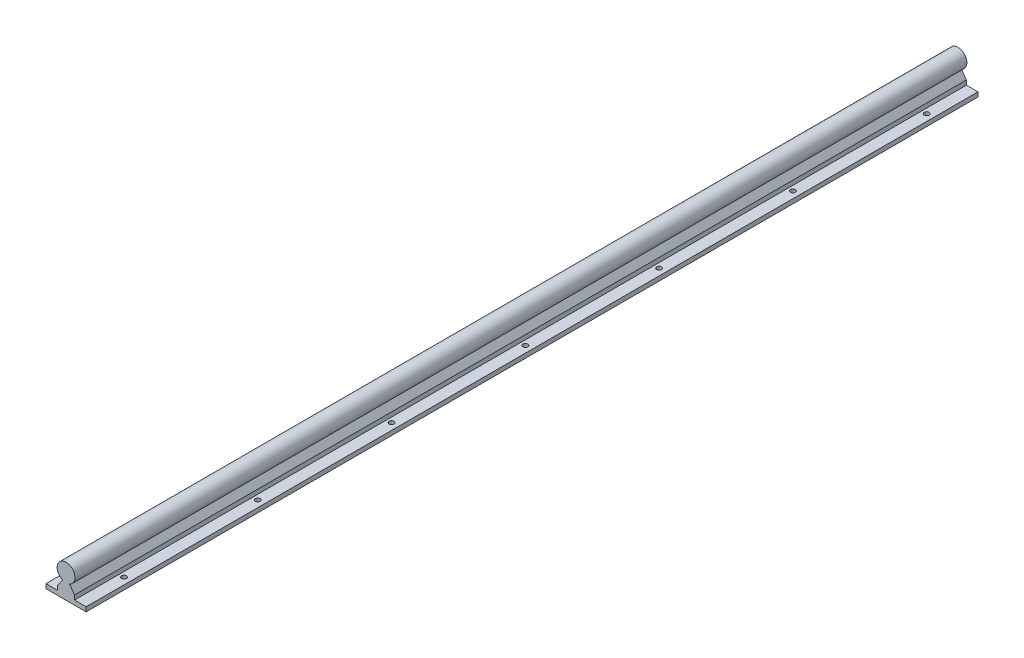
ISO-10303-21;
HEADER;
FILE_DESCRIPTION(('STEP AP214'),'2;1');
FILE_NAME('part.step','',(''),(''),'','','');
FILE_SCHEMA(('AUTOMOTIVE_DESIGN { 1 0 10303 214 1 1 1 1 }'));
ENDSEC;
DATA;
#1=APPLICATION_CONTEXT('core data for automotive mechanical design processes');
#2=APPLICATION_PROTOCOL_DEFINITION('international standard','automotive_design',2000,#1);
#3=PRODUCT_CONTEXT('',#1,'mechanical');
#4=PRODUCT('Part','Part','',(#3));
#5=PRODUCT_RELATED_PRODUCT_CATEGORY('part','',(#4));
#6=PRODUCT_DEFINITION_FORMATION('','',#4);
#7=PRODUCT_DEFINITION_CONTEXT('part definition',#1,'design');
#8=PRODUCT_DEFINITION('design','',#6,#7);
#9=PRODUCT_DEFINITION_SHAPE('','',#8);
#10=(LENGTH_UNIT() NAMED_UNIT(*) SI_UNIT(.MILLI.,.METRE.));
#11=(NAMED_UNIT(*) PLANE_ANGLE_UNIT() SI_UNIT($,.RADIAN.));
#12=(NAMED_UNIT(*) SI_UNIT($,.STERADIAN.) SOLID_ANGLE_UNIT());
#13=UNCERTAINTY_MEASURE_WITH_UNIT(LENGTH_MEASURE(1.E-05),#10,'distance_accuracy_value','');
#14=(GEOMETRIC_REPRESENTATION_CONTEXT(3) GLOBAL_UNCERTAINTY_ASSIGNED_CONTEXT((#13)) GLOBAL_UNIT_ASSIGNED_CONTEXT((#10,
#11,#12)) REPRESENTATION_CONTEXT('',''));
#15=CARTESIAN_POINT('',(0.,0.,0.));
#16=DIRECTION('',(0.,0.,1.));
#17=DIRECTION('',(1.,0.,0.));
#18=AXIS2_PLACEMENT_3D('',#15,#16,#17);
#19=CARTESIAN_POINT('',(0.,27.,1000.));
#20=DIRECTION('',(0.,0.,-1.));
#21=DIRECTION('',(-1.,0.,0.));
#22=AXIS2_PLACEMENT_3D('',#19,#20,#21);
#23=CYLINDRICAL_SURFACE('',#22,10.);
#24=CARTESIAN_POINT('',(0.,27.,0.));
#25=DIRECTION('',(0.,0.,1.));
#26=DIRECTION('',(1.,0.,0.));
#27=AXIS2_PLACEMENT_3D('',#24,#25,#26);
#28=CIRCLE('',#27,10.);
#29=CARTESIAN_POINT('',(3.67559518989783,17.7,0.));
#30=VERTEX_POINT('',#29);
#31=CARTESIAN_POINT('',(-3.67559518989783,17.7,0.));
#32=VERTEX_POINT('',#31);
#33=EDGE_CURVE('E160',#30,#32,#28,.T.);
#34=ORIENTED_EDGE('',*,*,#33,.T.);
#35=DIRECTION('',(0.,0.,-1.));
#36=VECTOR('',#35,1.);
#37=CARTESIAN_POINT('',(-3.67559518989783,17.7,1000.));
#38=LINE('',#37,#36);
#39=CARTESIAN_POINT('',(-3.67559518989783,17.7,1000.));
#40=VERTEX_POINT('',#39);
#41=EDGE_CURVE('E11',#40,#32,#38,.T.);
#42=ORIENTED_EDGE('',*,*,#41,.F.);
#43=CARTESIAN_POINT('',(0.,27.,1000.));
#44=DIRECTION('',(0.,0.,1.));
#45=DIRECTION('',(1.,0.,0.));
#46=AXIS2_PLACEMENT_3D('',#43,#44,#45);
#47=CIRCLE('',#46,10.);
#48=CARTESIAN_POINT('',(3.67559518989783,17.7,1000.));
#49=VERTEX_POINT('',#48);
#50=EDGE_CURVE('E189',#49,#40,#47,.T.);
#51=ORIENTED_EDGE('',*,*,#50,.F.);
#52=DIRECTION('',(0.,0.,-1.));
#53=VECTOR('',#52,1.);
#54=CARTESIAN_POINT('',(3.67559518989783,17.7,1000.));
#55=LINE('',#54,#53);
#56=EDGE_CURVE('E56',#49,#30,#55,.T.);
#57=ORIENTED_EDGE('',*,*,#56,.T.);
#58=EDGE_LOOP('',(#34,#42,#51,#57));
#59=FACE_BOUND('',#58,.T.);
#60=ADVANCED_FACE('F38',(#59),#23,.T.);
#61=CARTESIAN_POINT('',(0.,17.7,1000.));
#62=DIRECTION('',(0.,-1.,0.));
#63=DIRECTION('',(0.,0.,-1.));
#64=AXIS2_PLACEMENT_3D('',#61,#62,#63);
#65=PLANE('',#64);
#66=DIRECTION('',(-1.,0.,0.));
#67=VECTOR('',#66,1.);
#68=CARTESIAN_POINT('',(0.,17.7,0.));
#69=LINE('',#68,#67);
#70=CARTESIAN_POINT('',(-4.,17.7,0.));
#71=VERTEX_POINT('',#70);
#72=EDGE_CURVE('E162',#32,#71,#69,.T.);
#73=ORIENTED_EDGE('',*,*,#72,.T.);
#74=DIRECTION('',(0.,0.,-1.));
#75=VECTOR('',#74,1.);
#76=CARTESIAN_POINT('',(-4.,17.7,1000.));
#77=LINE('',#76,#75);
#78=CARTESIAN_POINT('',(-4.,17.7,1000.));
#79=VERTEX_POINT('',#78);
#80=EDGE_CURVE('E47',#79,#71,#77,.T.);
#81=ORIENTED_EDGE('',*,*,#80,.F.);
#82=DIRECTION('',(-1.,0.,0.));
#83=VECTOR('',#82,1.);
#84=CARTESIAN_POINT('',(0.,17.7,1000.));
#85=LINE('',#84,#83);
#86=EDGE_CURVE('E106',#40,#79,#85,.T.);
#87=ORIENTED_EDGE('',*,*,#86,.F.);
#88=ORIENTED_EDGE('',*,*,#41,.T.);
#89=EDGE_LOOP('',(#73,#81,#87,#88));
#90=FACE_BOUND('',#89,.T.);
#91=ADVANCED_FACE('F296',(#90),#65,.F.);
#92=CARTESIAN_POINT('',(-11.0202702702703,7.87162162162162,1000.));
#93=DIRECTION('',(0.813733471206735,-0.581238193719096,0.));
#94=DIRECTION('',(0.581238193719096,0.813733471206735,0.));
#95=AXIS2_PLACEMENT_3D('',#92,#93,#94);
#96=PLANE('',#95);
#97=DIRECTION('',(-0.581238193719096,-0.813733471206735,0.));
#98=VECTOR('',#97,1.);
#99=CARTESIAN_POINT('',(-11.0202702702703,7.87162162162162,0.));
#100=LINE('',#99,#98);
#101=CARTESIAN_POINT('',(-9.5,10.,0.));
#102=VERTEX_POINT('',#101);
#103=EDGE_CURVE('E165',#71,#102,#100,.T.);
#104=ORIENTED_EDGE('',*,*,#103,.T.);
#105=DIRECTION('',(0.,0.,-1.));
#106=VECTOR('',#105,1.);
#107=CARTESIAN_POINT('',(-9.5,10.,1000.));
#108=LINE('',#107,#106);
#109=CARTESIAN_POINT('',(-9.5,10.,1000.));
#110=VERTEX_POINT('',#109);
#111=EDGE_CURVE('E205',#110,#102,#108,.T.);
#112=ORIENTED_EDGE('',*,*,#111,.F.);
#113=DIRECTION('',(-0.581238193719096,-0.813733471206735,0.));
#114=VECTOR('',#113,1.);
#115=CARTESIAN_POINT('',(-11.0202702702703,7.87162162162162,1000.));
#116=LINE('',#115,#114);
#117=EDGE_CURVE('E259',#79,#110,#116,.T.);
#118=ORIENTED_EDGE('',*,*,#117,.F.);
#119=ORIENTED_EDGE('',*,*,#80,.T.);
#120=EDGE_LOOP('',(#104,#112,#118,#119));
#121=FACE_BOUND('',#120,.T.);
#122=ADVANCED_FACE('F300',(#121),#96,.F.);
#123=CARTESIAN_POINT('',(-9.5,0.,1000.));
#124=DIRECTION('',(1.,0.,0.));
#125=DIRECTION('',(0.,1.,0.));
#126=AXIS2_PLACEMENT_3D('',#123,#124,#125);
#127=PLANE('',#126);
#128=DIRECTION('',(0.,-1.,0.));
#129=VECTOR('',#128,1.);
#130=CARTESIAN_POINT('',(-9.5,0.,0.));
#131=LINE('',#130,#129);
#132=CARTESIAN_POINT('',(-9.5,5.,0.));
#133=VERTEX_POINT('',#132);
#134=EDGE_CURVE('E167',#102,#133,#131,.T.);
#135=ORIENTED_EDGE('',*,*,#134,.T.);
#136=DIRECTION('',(0.,0.,-1.));
#137=VECTOR('',#136,1.);
#138=CARTESIAN_POINT('',(-9.5,5.,1000.));
#139=LINE('',#138,#137);
#140=CARTESIAN_POINT('',(-9.5,5.,1000.));
#141=VERTEX_POINT('',#140);
#142=EDGE_CURVE('E203',#141,#133,#139,.T.);
#143=ORIENTED_EDGE('',*,*,#142,.F.);
#144=DIRECTION('',(0.,-1.,0.));
#145=VECTOR('',#144,1.);
#146=CARTESIAN_POINT('',(-9.5,0.,1000.));
#147=LINE('',#146,#145);
#148=EDGE_CURVE('E261',#110,#141,#147,.T.);
#149=ORIENTED_EDGE('',*,*,#148,.F.);
#150=ORIENTED_EDGE('',*,*,#111,.T.);
#151=EDGE_LOOP('',(#135,#143,#149,#150));
#152=FACE_BOUND('',#151,.T.);
#153=ADVANCED_FACE('F310',(#152),#127,.F.);
#154=CARTESIAN_POINT('',(0.,5.,1000.));
#155=DIRECTION('',(0.,1.,0.));
#156=DIRECTION('',(-1.,0.,0.));
#157=AXIS2_PLACEMENT_3D('',#154,#155,#156);
#158=PLANE('',#157);
#159=CARTESIAN_POINT('',(-15.0000000000068,5.,50.0000000000001));
#160=DIRECTION('',(0.,1.,0.));
#161=DIRECTION('',(-1.,0.,0.));
#162=AXIS2_PLACEMENT_3D('',#159,#160,#161);
#163=CIRCLE('',#162,2.74999999999998);
#164=CARTESIAN_POINT('',(-17.7500000000068,5.,50.0000000000001));
#165=VERTEX_POINT('',#164);
#166=EDGE_CURVE('E163',#165,#165,#163,.F.);
#167=ORIENTED_EDGE('',*,*,#166,.T.);
#168=EDGE_LOOP('',(#167));
#169=FACE_BOUND('',#168,.T.);
#170=CARTESIAN_POINT('',(-15.0000000000058,5.,350.));
#171=DIRECTION('',(0.,1.,0.));
#172=DIRECTION('',(-1.,0.,0.));
#173=AXIS2_PLACEMENT_3D('',#170,#171,#172);
#174=CIRCLE('',#173,2.75);
#175=CARTESIAN_POINT('',(-17.7500000000058,5.,350.));
#176=VERTEX_POINT('',#175);
#177=EDGE_CURVE('E252',#176,#176,#174,.F.);
#178=ORIENTED_EDGE('',*,*,#177,.T.);
#179=EDGE_LOOP('',(#178));
#180=FACE_BOUND('',#179,.T.);
#181=CARTESIAN_POINT('',(-15.0000000000053,5.,500.));
#182=DIRECTION('',(0.,1.,0.));
#183=DIRECTION('',(-1.,0.,0.));
#184=AXIS2_PLACEMENT_3D('',#181,#182,#183);
#185=CIRCLE('',#184,2.74999999999999);
#186=CARTESIAN_POINT('',(-17.7500000000052,5.,500.));
#187=VERTEX_POINT('',#186);
#188=EDGE_CURVE('E249',#187,#187,#185,.F.);
#189=ORIENTED_EDGE('',*,*,#188,.T.);
#190=EDGE_LOOP('',(#189));
#191=FACE_BOUND('',#190,.T.);
#192=CARTESIAN_POINT('',(-15.0000000000037,5.,650.));
#193=DIRECTION('',(0.,1.,0.));
#194=DIRECTION('',(-1.,0.,0.));
#195=AXIS2_PLACEMENT_3D('',#192,#193,#194);
#196=CIRCLE('',#195,2.74999999999992);
#197=CARTESIAN_POINT('',(-17.7500000000036,5.,650.));
#198=VERTEX_POINT('',#197);
#199=EDGE_CURVE('E246',#198,#198,#196,.F.);
#200=ORIENTED_EDGE('',*,*,#199,.T.);
#201=EDGE_LOOP('',(#200));
#202=FACE_BOUND('',#201,.T.);
#203=CARTESIAN_POINT('',(-15.0000000000021,5.,800.));
#204=DIRECTION('',(0.,1.,0.));
#205=DIRECTION('',(-1.,0.,0.));
#206=AXIS2_PLACEMENT_3D('',#203,#204,#205);
#207=CIRCLE('',#206,2.74999999999993);
#208=CARTESIAN_POINT('',(-17.7500000000021,5.,800.));
#209=VERTEX_POINT('',#208);
#210=EDGE_CURVE('E239',#209,#209,#207,.F.);
#211=ORIENTED_EDGE('',*,*,#210,.T.);
#212=EDGE_LOOP('',(#211));
#213=FACE_BOUND('',#212,.T.);
#214=CARTESIAN_POINT('',(-15.0000000000006,5.,950.));
#215=DIRECTION('',(0.,1.,0.));
#216=DIRECTION('',(-1.,0.,0.));
#217=AXIS2_PLACEMENT_3D('',#214,#215,#216);
#218=CIRCLE('',#217,2.74999999999993);
#219=CARTESIAN_POINT('',(-17.7500000000005,5.,950.));
#220=VERTEX_POINT('',#219);
#221=EDGE_CURVE('E234',#220,#220,#218,.F.);
#222=ORIENTED_EDGE('',*,*,#221,.T.);
#223=EDGE_LOOP('',(#222));
#224=FACE_BOUND('',#223,.T.);
#225=CARTESIAN_POINT('',(-15.0000000000063,5.,200.));
#226=DIRECTION('',(0.,1.,0.));
#227=DIRECTION('',(-1.,0.,0.));
#228=AXIS2_PLACEMENT_3D('',#225,#226,#227);
#229=CIRCLE('',#228,2.74999999999998);
#230=CARTESIAN_POINT('',(-17.7500000000063,5.,200.));
#231=VERTEX_POINT('',#230);
#232=EDGE_CURVE('E230',#231,#231,#229,.F.);
#233=ORIENTED_EDGE('',*,*,#232,.T.);
#234=EDGE_LOOP('',(#233));
#235=FACE_BOUND('',#234,.T.);
#236=DIRECTION('',(1.,0.,0.));
#237=VECTOR('',#236,1.);
#238=CARTESIAN_POINT('',(0.,5.,0.));
#239=LINE('',#238,#237);
#240=CARTESIAN_POINT('',(-22.5,5.,0.));
#241=VERTEX_POINT('',#240);
#242=EDGE_CURVE('E170',#241,#133,#239,.T.);
#243=ORIENTED_EDGE('',*,*,#242,.F.);
#244=DIRECTION('',(0.,0.,-1.));
#245=VECTOR('',#244,1.);
#246=CARTESIAN_POINT('',(-22.5,5.,1000.));
#247=LINE('',#246,#245);
#248=CARTESIAN_POINT('',(-22.5,5.,1000.));
#249=VERTEX_POINT('',#248);
#250=EDGE_CURVE('E201',#249,#241,#247,.T.);
#251=ORIENTED_EDGE('',*,*,#250,.F.);
#252=DIRECTION('',(1.,0.,0.));
#253=VECTOR('',#252,1.);
#254=CARTESIAN_POINT('',(0.,5.,1000.));
#255=LINE('',#254,#253);
#256=EDGE_CURVE('E263',#249,#141,#255,.T.);
#257=ORIENTED_EDGE('',*,*,#256,.T.);
#258=ORIENTED_EDGE('',*,*,#142,.T.);
#259=EDGE_LOOP('',(#243,#251,#257,#258));
#260=FACE_BOUND('',#259,.T.);
#261=ADVANCED_FACE('F328',(#169,#180,#191,#202,#213,#224,#235,#260),#158,.T.);
#262=CARTESIAN_POINT('',(-22.5,0.,1000.));
#263=DIRECTION('',(-1.,0.,0.));
#264=DIRECTION('',(0.,0.,1.));
#265=AXIS2_PLACEMENT_3D('',#262,#263,#264);
#266=PLANE('',#265);
#267=DIRECTION('',(0.,1.,0.));
#268=VECTOR('',#267,1.);
#269=CARTESIAN_POINT('',(-22.5,0.,0.));
#270=LINE('',#269,#268);
#271=CARTESIAN_POINT('',(-22.5,0.,0.));
#272=VERTEX_POINT('',#271);
#273=EDGE_CURVE('E173',#272,#241,#270,.T.);
#274=ORIENTED_EDGE('',*,*,#273,.F.);
#275=DIRECTION('',(0.,0.,-1.));
#276=VECTOR('',#275,1.);
#277=CARTESIAN_POINT('',(-22.5,0.,1000.));
#278=LINE('',#277,#276);
#279=CARTESIAN_POINT('',(-22.5,0.,1000.));
#280=VERTEX_POINT('',#279);
#281=EDGE_CURVE('E199',#280,#272,#278,.T.);
#282=ORIENTED_EDGE('',*,*,#281,.F.);
#283=DIRECTION('',(0.,1.,0.));
#284=VECTOR('',#283,1.);
#285=CARTESIAN_POINT('',(-22.5,0.,1000.));
#286=LINE('',#285,#284);
#287=EDGE_CURVE('E266',#280,#249,#286,.T.);
#288=ORIENTED_EDGE('',*,*,#287,.T.);
#289=ORIENTED_EDGE('',*,*,#250,.T.);
#290=EDGE_LOOP('',(#274,#282,#288,#289));
#291=FACE_BOUND('',#290,.T.);
#292=ADVANCED_FACE('F316',(#291),#266,.T.);
#293=CARTESIAN_POINT('',(0.,0.,1000.));
#294=DIRECTION('',(0.,1.,0.));
#295=DIRECTION('',(0.,0.,1.));
#296=AXIS2_PLACEMENT_3D('',#293,#294,#295);
#297=PLANE('',#296);
#298=CARTESIAN_POINT('',(14.9999999999947,0.,500.));
#299=DIRECTION('',(0.,1.,0.));
#300=DIRECTION('',(0.,0.,1.));
#301=AXIS2_PLACEMENT_3D('',#298,#299,#300);
#302=CIRCLE('',#301,2.75000000000003);
#303=CARTESIAN_POINT('',(14.9999999999947,0.,502.75));
#304=VERTEX_POINT('',#303);
#305=EDGE_CURVE('E567',#304,#304,#302,.T.);
#306=ORIENTED_EDGE('',*,*,#305,.T.);
#307=EDGE_LOOP('',(#306));
#308=FACE_BOUND('',#307,.T.);
#309=CARTESIAN_POINT('',(14.9999999999932,0.,50.0000000000001));
#310=DIRECTION('',(0.,1.,0.));
#311=DIRECTION('',(0.,0.,1.));
#312=AXIS2_PLACEMENT_3D('',#309,#310,#311);
#313=CIRCLE('',#312,2.75000000000003);
#314=CARTESIAN_POINT('',(14.9999999999932,0.,52.7500000000001));
#315=VERTEX_POINT('',#314);
#316=EDGE_CURVE('E563',#315,#315,#313,.T.);
#317=ORIENTED_EDGE('',*,*,#316,.T.);
#318=EDGE_LOOP('',(#317));
#319=FACE_BOUND('',#318,.T.);
#320=CARTESIAN_POINT('',(-15.0000000000068,0.,50.0000000000001));
#321=DIRECTION('',(0.,1.,0.));
#322=DIRECTION('',(0.,0.,1.));
#323=AXIS2_PLACEMENT_3D('',#320,#321,#322);
#324=CIRCLE('',#323,2.74999999999998);
#325=CARTESIAN_POINT('',(-15.0000000000068,0.,52.7500000000001));
#326=VERTEX_POINT('',#325);
#327=EDGE_CURVE('E561',#326,#326,#324,.T.);
#328=ORIENTED_EDGE('',*,*,#327,.T.);
#329=EDGE_LOOP('',(#328));
#330=FACE_BOUND('',#329,.T.);
#331=CARTESIAN_POINT('',(14.9999999999937,0.,200.));
#332=DIRECTION('',(0.,1.,0.));
#333=DIRECTION('',(0.,0.,1.));
#334=AXIS2_PLACEMENT_3D('',#331,#332,#333);
#335=CIRCLE('',#334,2.75000000000003);
#336=CARTESIAN_POINT('',(14.9999999999937,0.,202.75));
#337=VERTEX_POINT('',#336);
#338=EDGE_CURVE('E564',#337,#337,#335,.T.);
#339=ORIENTED_EDGE('',*,*,#338,.T.);
#340=EDGE_LOOP('',(#339));
#341=FACE_BOUND('',#340,.T.);
#342=CARTESIAN_POINT('',(14.9999999999942,0.,350.));
#343=DIRECTION('',(0.,1.,0.));
#344=DIRECTION('',(0.,0.,1.));
#345=AXIS2_PLACEMENT_3D('',#342,#343,#344);
#346=CIRCLE('',#345,2.75000000000002);
#347=CARTESIAN_POINT('',(14.9999999999942,0.,352.75));
#348=VERTEX_POINT('',#347);
#349=EDGE_CURVE('E576',#348,#348,#346,.T.);
#350=ORIENTED_EDGE('',*,*,#349,.T.);
#351=EDGE_LOOP('',(#350));
#352=FACE_BOUND('',#351,.T.);
#353=CARTESIAN_POINT('',(-15.0000000000058,0.,350.));
#354=DIRECTION('',(0.,1.,0.));
#355=DIRECTION('',(0.,0.,1.));
#356=AXIS2_PLACEMENT_3D('',#353,#354,#355);
#357=CIRCLE('',#356,2.75);
#358=CARTESIAN_POINT('',(-15.0000000000058,0.,352.75));
#359=VERTEX_POINT('',#358);
#360=EDGE_CURVE('E584',#359,#359,#357,.T.);
#361=ORIENTED_EDGE('',*,*,#360,.T.);
#362=EDGE_LOOP('',(#361));
#363=FACE_BOUND('',#362,.T.);
#364=CARTESIAN_POINT('',(-15.0000000000053,0.,500.));
#365=DIRECTION('',(0.,1.,0.));
#366=DIRECTION('',(0.,0.,1.));
#367=AXIS2_PLACEMENT_3D('',#364,#365,#366);
#368=CIRCLE('',#367,2.74999999999999);
#369=CARTESIAN_POINT('',(-15.0000000000053,0.,502.75));
#370=VERTEX_POINT('',#369);
#371=EDGE_CURVE('E581',#370,#370,#368,.T.);
#372=ORIENTED_EDGE('',*,*,#371,.T.);
#373=EDGE_LOOP('',(#372));
#374=FACE_BOUND('',#373,.T.);
#375=CARTESIAN_POINT('',(-15.0000000000037,0.,650.));
#376=DIRECTION('',(0.,1.,0.));
#377=DIRECTION('',(0.,0.,1.));
#378=AXIS2_PLACEMENT_3D('',#375,#376,#377);
#379=CIRCLE('',#378,2.74999999999992);
#380=CARTESIAN_POINT('',(-15.0000000000037,0.,652.75));
#381=VERTEX_POINT('',#380);
#382=EDGE_CURVE('E578',#381,#381,#379,.T.);
#383=ORIENTED_EDGE('',*,*,#382,.T.);
#384=EDGE_LOOP('',(#383));
#385=FACE_BOUND('',#384,.T.);
#386=CARTESIAN_POINT('',(-15.0000000000021,0.,800.));
#387=DIRECTION('',(0.,1.,0.));
#388=DIRECTION('',(0.,0.,1.));
#389=AXIS2_PLACEMENT_3D('',#386,#387,#388);
#390=CIRCLE('',#389,2.74999999999993);
#391=CARTESIAN_POINT('',(-15.0000000000021,0.,802.75));
#392=VERTEX_POINT('',#391);
#393=EDGE_CURVE('E623',#392,#392,#390,.T.);
#394=ORIENTED_EDGE('',*,*,#393,.T.);
#395=EDGE_LOOP('',(#394));
#396=FACE_BOUND('',#395,.T.);
#397=CARTESIAN_POINT('',(-15.0000000000006,0.,950.));
#398=DIRECTION('',(0.,1.,0.));
#399=DIRECTION('',(0.,0.,1.));
#400=AXIS2_PLACEMENT_3D('',#397,#398,#399);
#401=CIRCLE('',#400,2.74999999999993);
#402=CARTESIAN_POINT('',(-15.0000000000006,0.,952.75));
#403=VERTEX_POINT('',#402);
#404=EDGE_CURVE('E573',#403,#403,#401,.T.);
#405=ORIENTED_EDGE('',*,*,#404,.T.);
#406=EDGE_LOOP('',(#405));
#407=FACE_BOUND('',#406,.T.);
#408=CARTESIAN_POINT('',(14.9999999999994,0.,950.));
#409=DIRECTION('',(0.,1.,0.));
#410=DIRECTION('',(0.,0.,1.));
#411=AXIS2_PLACEMENT_3D('',#408,#409,#410);
#412=CIRCLE('',#411,2.74999999999994);
#413=CARTESIAN_POINT('',(14.9999999999994,0.,952.75));
#414=VERTEX_POINT('',#413);
#415=EDGE_CURVE('E630',#414,#414,#412,.T.);
#416=ORIENTED_EDGE('',*,*,#415,.T.);
#417=EDGE_LOOP('',(#416));
#418=FACE_BOUND('',#417,.T.);
#419=CARTESIAN_POINT('',(14.9999999999979,0.,800.));
#420=DIRECTION('',(0.,1.,0.));
#421=DIRECTION('',(0.,0.,1.));
#422=AXIS2_PLACEMENT_3D('',#419,#420,#421);
#423=CIRCLE('',#422,2.74999999999994);
#424=CARTESIAN_POINT('',(14.9999999999979,0.,802.75));
#425=VERTEX_POINT('',#424);
#426=EDGE_CURVE('E634',#425,#425,#423,.T.);
#427=ORIENTED_EDGE('',*,*,#426,.T.);
#428=EDGE_LOOP('',(#427));
#429=FACE_BOUND('',#428,.T.);
#430=CARTESIAN_POINT('',(-15.0000000000063,0.,200.));
#431=DIRECTION('',(0.,1.,0.));
#432=DIRECTION('',(0.,0.,1.));
#433=AXIS2_PLACEMENT_3D('',#430,#431,#432);
#434=CIRCLE('',#433,2.74999999999998);
#435=CARTESIAN_POINT('',(-15.0000000000063,0.,202.75));
#436=VERTEX_POINT('',#435);
#437=EDGE_CURVE('E570',#436,#436,#434,.T.);
#438=ORIENTED_EDGE('',*,*,#437,.T.);
#439=EDGE_LOOP('',(#438));
#440=FACE_BOUND('',#439,.T.);
#441=CARTESIAN_POINT('',(14.9999999999963,0.,650.));
#442=DIRECTION('',(0.,1.,0.));
#443=DIRECTION('',(0.,0.,1.));
#444=AXIS2_PLACEMENT_3D('',#441,#442,#443);
#445=CIRCLE('',#444,2.74999999999994);
#446=CARTESIAN_POINT('',(14.9999999999963,0.,652.75));
#447=VERTEX_POINT('',#446);
#448=EDGE_CURVE('E214',#447,#447,#445,.T.);
#449=ORIENTED_EDGE('',*,*,#448,.T.);
#450=EDGE_LOOP('',(#449));
#451=FACE_BOUND('',#450,.T.);
#452=DIRECTION('',(1.,0.,0.));
#453=VECTOR('',#452,1.);
#454=CARTESIAN_POINT('',(0.,0.,0.));
#455=LINE('',#454,#453);
#456=CARTESIAN_POINT('',(22.5,0.,0.));
#457=VERTEX_POINT('',#456);
#458=EDGE_CURVE('E176',#272,#457,#455,.T.);
#459=ORIENTED_EDGE('',*,*,#458,.T.);
#460=DIRECTION('',(0.,0.,-1.));
#461=VECTOR('',#460,1.);
#462=CARTESIAN_POINT('',(22.5,0.,1000.));
#463=LINE('',#462,#461);
#464=CARTESIAN_POINT('',(22.5,0.,1000.));
#465=VERTEX_POINT('',#464);
#466=EDGE_CURVE('E196',#465,#457,#463,.T.);
#467=ORIENTED_EDGE('',*,*,#466,.F.);
#468=DIRECTION('',(1.,0.,0.));
#469=VECTOR('',#468,1.);
#470=CARTESIAN_POINT('',(0.,0.,1000.));
#471=LINE('',#470,#469);
#472=EDGE_CURVE('E269',#280,#465,#471,.T.);
#473=ORIENTED_EDGE('',*,*,#472,.F.);
#474=ORIENTED_EDGE('',*,*,#281,.T.);
#475=EDGE_LOOP('',(#459,#467,#473,#474));
#476=FACE_BOUND('',#475,.T.);
#477=ADVANCED_FACE('F319',(#308,#319,#330,#341,#352,#363,#374,#385,#396,#407,#418,#429,#440,
#451,#476),#297,.F.);
#478=CARTESIAN_POINT('',(22.5,0.,1000.));
#479=DIRECTION('',(-1.,0.,0.));
#480=DIRECTION('',(0.,0.,1.));
#481=AXIS2_PLACEMENT_3D('',#478,#479,#480);
#482=PLANE('',#481);
#483=DIRECTION('',(0.,1.,0.));
#484=VECTOR('',#483,1.);
#485=CARTESIAN_POINT('',(22.5,0.,0.));
#486=LINE('',#485,#484);
#487=CARTESIAN_POINT('',(22.5,5.,0.));
#488=VERTEX_POINT('',#487);
#489=EDGE_CURVE('E178',#457,#488,#486,.T.);
#490=ORIENTED_EDGE('',*,*,#489,.T.);
#491=DIRECTION('',(0.,0.,-1.));
#492=VECTOR('',#491,1.);
#493=CARTESIAN_POINT('',(22.5,5.,1000.));
#494=LINE('',#493,#492);
#495=CARTESIAN_POINT('',(22.5,5.,1000.));
#496=VERTEX_POINT('',#495);
#497=EDGE_CURVE('E193',#496,#488,#494,.T.);
#498=ORIENTED_EDGE('',*,*,#497,.F.);
#499=DIRECTION('',(0.,1.,0.));
#500=VECTOR('',#499,1.);
#501=CARTESIAN_POINT('',(22.5,0.,1000.));
#502=LINE('',#501,#500);
#503=EDGE_CURVE('E271',#465,#496,#502,.T.);
#504=ORIENTED_EDGE('',*,*,#503,.F.);
#505=ORIENTED_EDGE('',*,*,#466,.T.);
#506=EDGE_LOOP('',(#490,#498,#504,#505));
#507=FACE_BOUND('',#506,.T.);
#508=ADVANCED_FACE('F278',(#507),#482,.F.);
#509=CARTESIAN_POINT('',(0.,5.,1000.));
#510=DIRECTION('',(0.,-1.,0.));
#511=DIRECTION('',(1.,0.,0.));
#512=AXIS2_PLACEMENT_3D('',#509,#510,#511);
#513=PLANE('',#512);
#514=CARTESIAN_POINT('',(14.9999999999947,5.,500.));
#515=DIRECTION('',(0.,-1.,0.));
#516=DIRECTION('',(1.,0.,0.));
#517=AXIS2_PLACEMENT_3D('',#514,#515,#516);
#518=CIRCLE('',#517,2.75000000000003);
#519=CARTESIAN_POINT('',(17.7499999999948,5.,500.));
#520=VERTEX_POINT('',#519);
#521=EDGE_CURVE('E41',#520,#520,#518,.F.);
#522=ORIENTED_EDGE('',*,*,#521,.F.);
#523=EDGE_LOOP('',(#522));
#524=FACE_BOUND('',#523,.T.);
#525=CARTESIAN_POINT('',(14.9999999999932,5.,50.0000000000001));
#526=DIRECTION('',(0.,-1.,0.));
#527=DIRECTION('',(1.,0.,0.));
#528=AXIS2_PLACEMENT_3D('',#525,#526,#527);
#529=CIRCLE('',#528,2.75000000000003);
#530=CARTESIAN_POINT('',(17.7499999999932,5.,50.0000000000001));
#531=VERTEX_POINT('',#530);
#532=EDGE_CURVE('E225',#531,#531,#529,.F.);
#533=ORIENTED_EDGE('',*,*,#532,.F.);
#534=EDGE_LOOP('',(#533));
#535=FACE_BOUND('',#534,.T.);
#536=CARTESIAN_POINT('',(14.9999999999937,5.,200.));
#537=DIRECTION('',(0.,-1.,0.));
#538=DIRECTION('',(1.,0.,0.));
#539=AXIS2_PLACEMENT_3D('',#536,#537,#538);
#540=CIRCLE('',#539,2.75000000000003);
#541=CARTESIAN_POINT('',(17.7499999999937,5.,200.));
#542=VERTEX_POINT('',#541);
#543=EDGE_CURVE('E223',#542,#542,#540,.F.);
#544=ORIENTED_EDGE('',*,*,#543,.F.);
#545=EDGE_LOOP('',(#544));
#546=FACE_BOUND('',#545,.T.);
#547=CARTESIAN_POINT('',(14.9999999999942,5.,350.));
#548=DIRECTION('',(0.,-1.,0.));
#549=DIRECTION('',(1.,0.,0.));
#550=AXIS2_PLACEMENT_3D('',#547,#548,#549);
#551=CIRCLE('',#550,2.75000000000002);
#552=CARTESIAN_POINT('',(17.7499999999942,5.,350.));
#553=VERTEX_POINT('',#552);
#554=EDGE_CURVE('E220',#553,#553,#551,.F.);
#555=ORIENTED_EDGE('',*,*,#554,.F.);
#556=EDGE_LOOP('',(#555));
#557=FACE_BOUND('',#556,.T.);
#558=CARTESIAN_POINT('',(14.9999999999994,5.,950.));
#559=DIRECTION('',(0.,-1.,0.));
#560=DIRECTION('',(1.,0.,0.));
#561=AXIS2_PLACEMENT_3D('',#558,#559,#560);
#562=CIRCLE('',#561,2.74999999999994);
#563=CARTESIAN_POINT('',(17.7499999999994,5.,950.));
#564=VERTEX_POINT('',#563);
#565=EDGE_CURVE('E217',#564,#564,#562,.F.);
#566=ORIENTED_EDGE('',*,*,#565,.F.);
#567=EDGE_LOOP('',(#566));
#568=FACE_BOUND('',#567,.T.);
#569=CARTESIAN_POINT('',(14.9999999999979,5.,800.));
#570=DIRECTION('',(0.,-1.,0.));
#571=DIRECTION('',(1.,0.,0.));
#572=AXIS2_PLACEMENT_3D('',#569,#570,#571);
#573=CIRCLE('',#572,2.74999999999994);
#574=CARTESIAN_POINT('',(17.7499999999978,5.,800.));
#575=VERTEX_POINT('',#574);
#576=EDGE_CURVE('E213',#575,#575,#573,.F.);
#577=ORIENTED_EDGE('',*,*,#576,.F.);
#578=EDGE_LOOP('',(#577));
#579=FACE_BOUND('',#578,.T.);
#580=CARTESIAN_POINT('',(14.9999999999963,5.,650.));
#581=DIRECTION('',(0.,-1.,0.));
#582=DIRECTION('',(1.,0.,0.));
#583=AXIS2_PLACEMENT_3D('',#580,#581,#582);
#584=CIRCLE('',#583,2.74999999999994);
#585=CARTESIAN_POINT('',(17.7499999999962,5.,650.));
#586=VERTEX_POINT('',#585);
#587=EDGE_CURVE('E210',#586,#586,#584,.F.);
#588=ORIENTED_EDGE('',*,*,#587,.F.);
#589=EDGE_LOOP('',(#588));
#590=FACE_BOUND('',#589,.T.);
#591=DIRECTION('',(-1.,0.,0.));
#592=VECTOR('',#591,1.);
#593=CARTESIAN_POINT('',(0.,5.,0.));
#594=LINE('',#593,#592);
#595=CARTESIAN_POINT('',(9.5,5.,0.));
#596=VERTEX_POINT('',#595);
#597=EDGE_CURVE('E180',#488,#596,#594,.T.);
#598=ORIENTED_EDGE('',*,*,#597,.T.);
#599=DIRECTION('',(0.,0.,-1.));
#600=VECTOR('',#599,1.);
#601=CARTESIAN_POINT('',(9.5,5.,1000.));
#602=LINE('',#601,#600);
#603=CARTESIAN_POINT('',(9.5,5.,1000.));
#604=VERTEX_POINT('',#603);
#605=EDGE_CURVE('E143',#604,#596,#602,.T.);
#606=ORIENTED_EDGE('',*,*,#605,.F.);
#607=DIRECTION('',(-1.,0.,0.));
#608=VECTOR('',#607,1.);
#609=CARTESIAN_POINT('',(0.,5.,1000.));
#610=LINE('',#609,#608);
#611=EDGE_CURVE('E151',#496,#604,#610,.T.);
#612=ORIENTED_EDGE('',*,*,#611,.F.);
#613=ORIENTED_EDGE('',*,*,#497,.T.);
#614=EDGE_LOOP('',(#598,#606,#612,#613));
#615=FACE_BOUND('',#614,.T.);
#616=ADVANCED_FACE('F282',(#524,#535,#546,#557,#568,#579,#590,#615),#513,.F.);
#617=CARTESIAN_POINT('',(9.5,0.,1000.));
#618=DIRECTION('',(1.,0.,0.));
#619=DIRECTION('',(0.,1.,0.));
#620=AXIS2_PLACEMENT_3D('',#617,#618,#619);
#621=PLANE('',#620);
#622=DIRECTION('',(0.,-1.,0.));
#623=VECTOR('',#622,1.);
#624=CARTESIAN_POINT('',(9.5,0.,0.));
#625=LINE('',#624,#623);
#626=CARTESIAN_POINT('',(9.5,10.,0.));
#627=VERTEX_POINT('',#626);
#628=EDGE_CURVE('E139',#627,#596,#625,.T.);
#629=ORIENTED_EDGE('',*,*,#628,.F.);
#630=DIRECTION('',(0.,0.,-1.));
#631=VECTOR('',#630,1.);
#632=CARTESIAN_POINT('',(9.5,10.,1000.));
#633=LINE('',#632,#631);
#634=CARTESIAN_POINT('',(9.5,10.,1000.));
#635=VERTEX_POINT('',#634);
#636=EDGE_CURVE('E134',#635,#627,#633,.T.);
#637=ORIENTED_EDGE('',*,*,#636,.F.);
#638=DIRECTION('',(0.,-1.,0.));
#639=VECTOR('',#638,1.);
#640=CARTESIAN_POINT('',(9.5,0.,1000.));
#641=LINE('',#640,#639);
#642=EDGE_CURVE('E137',#635,#604,#641,.T.);
#643=ORIENTED_EDGE('',*,*,#642,.T.);
#644=ORIENTED_EDGE('',*,*,#605,.T.);
#645=EDGE_LOOP('',(#629,#637,#643,#644));
#646=FACE_BOUND('',#645,.T.);
#647=ADVANCED_FACE('F136',(#646),#621,.T.);
#648=CARTESIAN_POINT('',(11.0202702702703,7.87162162162162,1000.));
#649=DIRECTION('',(0.813733471206735,0.581238193719096,0.));
#650=DIRECTION('',(-0.581238193719096,0.813733471206735,0.));
#651=AXIS2_PLACEMENT_3D('',#648,#649,#650);
#652=PLANE('',#651);
#653=DIRECTION('',(0.581238193719096,-0.813733471206735,0.));
#654=VECTOR('',#653,1.);
#655=CARTESIAN_POINT('',(11.0202702702703,7.87162162162162,0.));
#656=LINE('',#655,#654);
#657=CARTESIAN_POINT('',(4.,17.7,0.));
#658=VERTEX_POINT('',#657);
#659=EDGE_CURVE('E184',#658,#627,#656,.T.);
#660=ORIENTED_EDGE('',*,*,#659,.F.);
#661=DIRECTION('',(0.,0.,-1.));
#662=VECTOR('',#661,1.);
#663=CARTESIAN_POINT('',(4.,17.7,1000.));
#664=LINE('',#663,#662);
#665=CARTESIAN_POINT('',(4.,17.7,1000.));
#666=VERTEX_POINT('',#665);
#667=EDGE_CURVE('E94',#666,#658,#664,.T.);
#668=ORIENTED_EDGE('',*,*,#667,.F.);
#669=DIRECTION('',(0.581238193719096,-0.813733471206735,0.));
#670=VECTOR('',#669,1.);
#671=CARTESIAN_POINT('',(11.0202702702703,7.87162162162162,1000.));
#672=LINE('',#671,#670);
#673=EDGE_CURVE('E149',#666,#635,#672,.T.);
#674=ORIENTED_EDGE('',*,*,#673,.T.);
#675=ORIENTED_EDGE('',*,*,#636,.T.);
#676=EDGE_LOOP('',(#660,#668,#674,#675));
#677=FACE_BOUND('',#676,.T.);
#678=ADVANCED_FACE('F154',(#677),#652,.T.);
#679=CARTESIAN_POINT('',(0.,17.7,1000.));
#680=DIRECTION('',(0.,1.,0.));
#681=DIRECTION('',(0.,0.,1.));
#682=AXIS2_PLACEMENT_3D('',#679,#680,#681);
#683=PLANE('',#682);
#684=DIRECTION('',(1.,0.,0.));
#685=VECTOR('',#684,1.);
#686=CARTESIAN_POINT('',(0.,17.7,0.));
#687=LINE('',#686,#685);
#688=EDGE_CURVE('E186',#30,#658,#687,.T.);
#689=ORIENTED_EDGE('',*,*,#688,.F.);
#690=ORIENTED_EDGE('',*,*,#56,.F.);
#691=DIRECTION('',(1.,0.,0.));
#692=VECTOR('',#691,1.);
#693=CARTESIAN_POINT('',(0.,17.7,1000.));
#694=LINE('',#693,#692);
#695=EDGE_CURVE('E155',#49,#666,#694,.T.);
#696=ORIENTED_EDGE('',*,*,#695,.T.);
#697=ORIENTED_EDGE('',*,*,#667,.T.);
#698=EDGE_LOOP('',(#689,#690,#696,#697));
#699=FACE_BOUND('',#698,.T.);
#700=ADVANCED_FACE('F285',(#699),#683,.T.);
#701=CARTESIAN_POINT('',(0.,0.,1000.));
#702=DIRECTION('',(0.,0.,1.));
#703=DIRECTION('',(1.,0.,0.));
#704=AXIS2_PLACEMENT_3D('',#701,#702,#703);
#705=PLANE('',#704);
#706=ORIENTED_EDGE('',*,*,#50,.T.);
#707=ORIENTED_EDGE('',*,*,#86,.T.);
#708=ORIENTED_EDGE('',*,*,#117,.T.);
#709=ORIENTED_EDGE('',*,*,#148,.T.);
#710=ORIENTED_EDGE('',*,*,#256,.F.);
#711=ORIENTED_EDGE('',*,*,#287,.F.);
#712=ORIENTED_EDGE('',*,*,#472,.T.);
#713=ORIENTED_EDGE('',*,*,#503,.T.);
#714=ORIENTED_EDGE('',*,*,#611,.T.);
#715=ORIENTED_EDGE('',*,*,#642,.F.);
#716=ORIENTED_EDGE('',*,*,#673,.F.);
#717=ORIENTED_EDGE('',*,*,#695,.F.);
#718=EDGE_LOOP('',(#706,#707,#708,#709,#710,#711,#712,#713,#714,#715,#716,#717));
#719=FACE_BOUND('',#718,.T.);
#720=ADVANCED_FACE('F147',(#719),#705,.T.);
#721=CARTESIAN_POINT('',(0.,0.,0.));
#722=DIRECTION('',(0.,0.,1.));
#723=DIRECTION('',(1.,0.,0.));
#724=AXIS2_PLACEMENT_3D('',#721,#722,#723);
#725=PLANE('',#724);
#726=ORIENTED_EDGE('',*,*,#33,.F.);
#727=ORIENTED_EDGE('',*,*,#688,.T.);
#728=ORIENTED_EDGE('',*,*,#659,.T.);
#729=ORIENTED_EDGE('',*,*,#628,.T.);
#730=ORIENTED_EDGE('',*,*,#597,.F.);
#731=ORIENTED_EDGE('',*,*,#489,.F.);
#732=ORIENTED_EDGE('',*,*,#458,.F.);
#733=ORIENTED_EDGE('',*,*,#273,.T.);
#734=ORIENTED_EDGE('',*,*,#242,.T.);
#735=ORIENTED_EDGE('',*,*,#134,.F.);
#736=ORIENTED_EDGE('',*,*,#103,.F.);
#737=ORIENTED_EDGE('',*,*,#72,.F.);
#738=EDGE_LOOP('',(#726,#727,#728,#729,#730,#731,#732,#733,#734,#735,#736,#737));
#739=FACE_BOUND('',#738,.T.);
#740=ADVANCED_FACE('F284',(#739),#725,.F.);
#741=CARTESIAN_POINT('',(14.9999999999963,450.,650.));
#742=DIRECTION('',(0.,-1.,0.));
#743=DIRECTION('',(0.,0.,-1.));
#744=AXIS2_PLACEMENT_3D('',#741,#742,#743);
#745=CYLINDRICAL_SURFACE('',#744,2.74999999999994);
#746=ORIENTED_EDGE('',*,*,#448,.F.);
#747=EDGE_LOOP('',(#746));
#748=FACE_BOUND('',#747,.T.);
#749=ORIENTED_EDGE('',*,*,#587,.T.);
#750=EDGE_LOOP('',(#749));
#751=FACE_BOUND('',#750,.T.);
#752=ADVANCED_FACE('F400',(#748,#751),#745,.F.);
#753=CARTESIAN_POINT('',(14.9999999999979,450.,800.));
#754=DIRECTION('',(0.,-1.,0.));
#755=DIRECTION('',(0.,0.,-1.));
#756=AXIS2_PLACEMENT_3D('',#753,#754,#755);
#757=CYLINDRICAL_SURFACE('',#756,2.74999999999994);
#758=ORIENTED_EDGE('',*,*,#426,.F.);
#759=EDGE_LOOP('',(#758));
#760=FACE_BOUND('',#759,.T.);
#761=ORIENTED_EDGE('',*,*,#576,.T.);
#762=EDGE_LOOP('',(#761));
#763=FACE_BOUND('',#762,.T.);
#764=ADVANCED_FACE('F410',(#760,#763),#757,.F.);
#765=CARTESIAN_POINT('',(14.9999999999994,450.,950.));
#766=DIRECTION('',(0.,-1.,0.));
#767=DIRECTION('',(0.,0.,-1.));
#768=AXIS2_PLACEMENT_3D('',#765,#766,#767);
#769=CYLINDRICAL_SURFACE('',#768,2.74999999999994);
#770=ORIENTED_EDGE('',*,*,#415,.F.);
#771=EDGE_LOOP('',(#770));
#772=FACE_BOUND('',#771,.T.);
#773=ORIENTED_EDGE('',*,*,#565,.T.);
#774=EDGE_LOOP('',(#773));
#775=FACE_BOUND('',#774,.T.);
#776=ADVANCED_FACE('F419',(#772,#775),#769,.F.);
#777=CARTESIAN_POINT('',(14.9999999999942,450.,350.));
#778=DIRECTION('',(0.,-1.,0.));
#779=DIRECTION('',(0.,0.,-1.));
#780=AXIS2_PLACEMENT_3D('',#777,#778,#779);
#781=CYLINDRICAL_SURFACE('',#780,2.75000000000002);
#782=ORIENTED_EDGE('',*,*,#349,.F.);
#783=EDGE_LOOP('',(#782));
#784=FACE_BOUND('',#783,.T.);
#785=ORIENTED_EDGE('',*,*,#554,.T.);
#786=EDGE_LOOP('',(#785));
#787=FACE_BOUND('',#786,.T.);
#788=ADVANCED_FACE('F427',(#784,#787),#781,.F.);
#789=CARTESIAN_POINT('',(14.9999999999937,450.,200.));
#790=DIRECTION('',(0.,-1.,0.));
#791=DIRECTION('',(0.,0.,-1.));
#792=AXIS2_PLACEMENT_3D('',#789,#790,#791);
#793=CYLINDRICAL_SURFACE('',#792,2.75000000000003);
#794=ORIENTED_EDGE('',*,*,#338,.F.);
#795=EDGE_LOOP('',(#794));
#796=FACE_BOUND('',#795,.T.);
#797=ORIENTED_EDGE('',*,*,#543,.T.);
#798=EDGE_LOOP('',(#797));
#799=FACE_BOUND('',#798,.T.);
#800=ADVANCED_FACE('F435',(#796,#799),#793,.F.);
#801=CARTESIAN_POINT('',(14.9999999999932,450.,50.0000000000001));
#802=DIRECTION('',(0.,-1.,0.));
#803=DIRECTION('',(0.,0.,-1.));
#804=AXIS2_PLACEMENT_3D('',#801,#802,#803);
#805=CYLINDRICAL_SURFACE('',#804,2.75000000000003);
#806=ORIENTED_EDGE('',*,*,#316,.F.);
#807=EDGE_LOOP('',(#806));
#808=FACE_BOUND('',#807,.T.);
#809=ORIENTED_EDGE('',*,*,#532,.T.);
#810=EDGE_LOOP('',(#809));
#811=FACE_BOUND('',#810,.T.);
#812=ADVANCED_FACE('F443',(#808,#811),#805,.F.);
#813=CARTESIAN_POINT('',(14.9999999999947,450.,500.));
#814=DIRECTION('',(0.,-1.,0.));
#815=DIRECTION('',(0.,0.,-1.));
#816=AXIS2_PLACEMENT_3D('',#813,#814,#815);
#817=CYLINDRICAL_SURFACE('',#816,2.75000000000003);
#818=ORIENTED_EDGE('',*,*,#305,.F.);
#819=EDGE_LOOP('',(#818));
#820=FACE_BOUND('',#819,.T.);
#821=ORIENTED_EDGE('',*,*,#521,.T.);
#822=EDGE_LOOP('',(#821));
#823=FACE_BOUND('',#822,.T.);
#824=ADVANCED_FACE('F451',(#820,#823),#817,.F.);
#825=CARTESIAN_POINT('',(-15.0000000000063,450.,200.));
#826=DIRECTION('',(0.,-1.,0.));
#827=DIRECTION('',(0.,0.,-1.));
#828=AXIS2_PLACEMENT_3D('',#825,#826,#827);
#829=CYLINDRICAL_SURFACE('',#828,2.74999999999998);
#830=ORIENTED_EDGE('',*,*,#232,.F.);
#831=EDGE_LOOP('',(#830));
#832=FACE_BOUND('',#831,.T.);
#833=ORIENTED_EDGE('',*,*,#437,.F.);
#834=EDGE_LOOP('',(#833));
#835=FACE_BOUND('',#834,.T.);
#836=ADVANCED_FACE('F459',(#832,#835),#829,.F.);
#837=CARTESIAN_POINT('',(-15.0000000000006,450.,950.));
#838=DIRECTION('',(0.,-1.,0.));
#839=DIRECTION('',(0.,0.,-1.));
#840=AXIS2_PLACEMENT_3D('',#837,#838,#839);
#841=CYLINDRICAL_SURFACE('',#840,2.74999999999993);
#842=ORIENTED_EDGE('',*,*,#221,.F.);
#843=EDGE_LOOP('',(#842));
#844=FACE_BOUND('',#843,.T.);
#845=ORIENTED_EDGE('',*,*,#404,.F.);
#846=EDGE_LOOP('',(#845));
#847=FACE_BOUND('',#846,.T.);
#848=ADVANCED_FACE('F467',(#844,#847),#841,.F.);
#849=CARTESIAN_POINT('',(-15.0000000000021,450.,800.));
#850=DIRECTION('',(0.,-1.,0.));
#851=DIRECTION('',(0.,0.,-1.));
#852=AXIS2_PLACEMENT_3D('',#849,#850,#851);
#853=CYLINDRICAL_SURFACE('',#852,2.74999999999993);
#854=ORIENTED_EDGE('',*,*,#210,.F.);
#855=EDGE_LOOP('',(#854));
#856=FACE_BOUND('',#855,.T.);
#857=ORIENTED_EDGE('',*,*,#393,.F.);
#858=EDGE_LOOP('',(#857));
#859=FACE_BOUND('',#858,.T.);
#860=ADVANCED_FACE('F475',(#856,#859),#853,.F.);
#861=CARTESIAN_POINT('',(-15.0000000000037,450.,650.));
#862=DIRECTION('',(0.,-1.,0.));
#863=DIRECTION('',(0.,0.,-1.));
#864=AXIS2_PLACEMENT_3D('',#861,#862,#863);
#865=CYLINDRICAL_SURFACE('',#864,2.74999999999992);
#866=ORIENTED_EDGE('',*,*,#199,.F.);
#867=EDGE_LOOP('',(#866));
#868=FACE_BOUND('',#867,.T.);
#869=ORIENTED_EDGE('',*,*,#382,.F.);
#870=EDGE_LOOP('',(#869));
#871=FACE_BOUND('',#870,.T.);
#872=ADVANCED_FACE('F483',(#868,#871),#865,.F.);
#873=CARTESIAN_POINT('',(-15.0000000000053,450.,500.));
#874=DIRECTION('',(0.,-1.,0.));
#875=DIRECTION('',(0.,0.,-1.));
#876=AXIS2_PLACEMENT_3D('',#873,#874,#875);
#877=CYLINDRICAL_SURFACE('',#876,2.74999999999999);
#878=ORIENTED_EDGE('',*,*,#188,.F.);
#879=EDGE_LOOP('',(#878));
#880=FACE_BOUND('',#879,.T.);
#881=ORIENTED_EDGE('',*,*,#371,.F.);
#882=EDGE_LOOP('',(#881));
#883=FACE_BOUND('',#882,.T.);
#884=ADVANCED_FACE('F491',(#880,#883),#877,.F.);
#885=CARTESIAN_POINT('',(-15.0000000000058,450.,350.));
#886=DIRECTION('',(0.,-1.,0.));
#887=DIRECTION('',(0.,0.,-1.));
#888=AXIS2_PLACEMENT_3D('',#885,#886,#887);
#889=CYLINDRICAL_SURFACE('',#888,2.75);
#890=ORIENTED_EDGE('',*,*,#177,.F.);
#891=EDGE_LOOP('',(#890));
#892=FACE_BOUND('',#891,.T.);
#893=ORIENTED_EDGE('',*,*,#360,.F.);
#894=EDGE_LOOP('',(#893));
#895=FACE_BOUND('',#894,.T.);
#896=ADVANCED_FACE('F499',(#892,#895),#889,.F.);
#897=CARTESIAN_POINT('',(-15.0000000000068,450.,50.0000000000001));
#898=DIRECTION('',(0.,-1.,0.));
#899=DIRECTION('',(0.,0.,-1.));
#900=AXIS2_PLACEMENT_3D('',#897,#898,#899);
#901=CYLINDRICAL_SURFACE('',#900,2.74999999999998);
#902=ORIENTED_EDGE('',*,*,#166,.F.);
#903=EDGE_LOOP('',(#902));
#904=FACE_BOUND('',#903,.T.);
#905=ORIENTED_EDGE('',*,*,#327,.F.);
#906=EDGE_LOOP('',(#905));
#907=FACE_BOUND('',#906,.T.);
#908=ADVANCED_FACE('F507',(#904,#907),#901,.F.);
#909=CLOSED_SHELL('',(#60,#91,#122,#153,#261,#292,#477,#508,#616,#647,#678,#700,#720,#740,#752,
#764,#776,#788,#800,#812,#824,#836,#848,#860,#872,#884,#896,#908));
#910=MANIFOLD_SOLID_BREP('B2',#909);
#911=ADVANCED_BREP_SHAPE_REPRESENTATION('',(#18,#910),#14);
#912=SHAPE_DEFINITION_REPRESENTATION(#9,#911);
ENDSEC;
END-ISO-10303-21;
